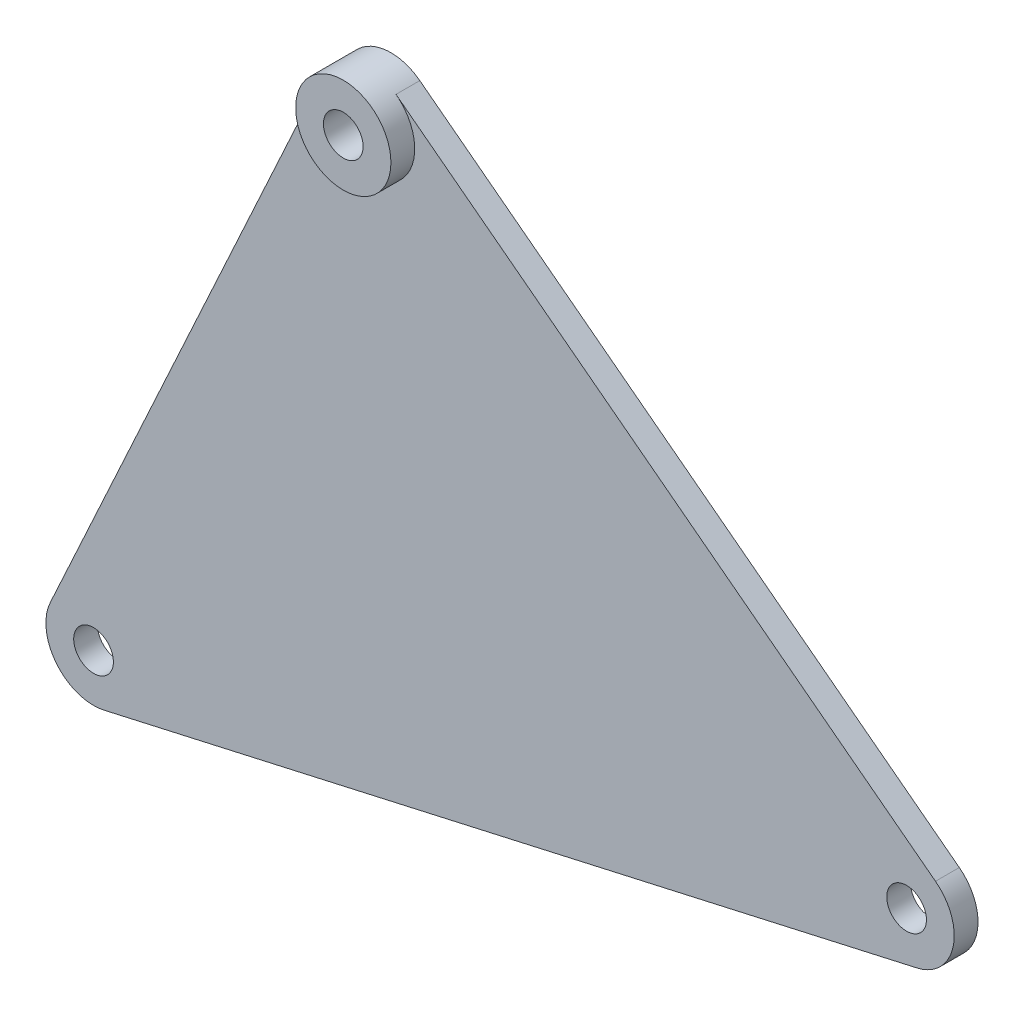
ISO-10303-21;
HEADER;
FILE_DESCRIPTION(('STEP AP214'),'2;1');
FILE_NAME('part.step','',(''),(''),'','','');
FILE_SCHEMA(('AUTOMOTIVE_DESIGN { 1 0 10303 214 1 1 1 1 }'));
ENDSEC;
DATA;
#1=APPLICATION_CONTEXT('core data for automotive mechanical design processes');
#2=APPLICATION_PROTOCOL_DEFINITION('international standard','automotive_design',2000,#1);
#3=PRODUCT_CONTEXT('',#1,'mechanical');
#4=PRODUCT('Part','Part','',(#3));
#5=PRODUCT_RELATED_PRODUCT_CATEGORY('part','',(#4));
#6=PRODUCT_DEFINITION_FORMATION('','',#4);
#7=PRODUCT_DEFINITION_CONTEXT('part definition',#1,'design');
#8=PRODUCT_DEFINITION('design','',#6,#7);
#9=PRODUCT_DEFINITION_SHAPE('','',#8);
#10=(LENGTH_UNIT() NAMED_UNIT(*) SI_UNIT(.MILLI.,.METRE.));
#11=(NAMED_UNIT(*) PLANE_ANGLE_UNIT() SI_UNIT($,.RADIAN.));
#12=(NAMED_UNIT(*) SI_UNIT($,.STERADIAN.) SOLID_ANGLE_UNIT());
#13=UNCERTAINTY_MEASURE_WITH_UNIT(LENGTH_MEASURE(1.E-05),#10,'distance_accuracy_value','');
#14=(GEOMETRIC_REPRESENTATION_CONTEXT(3) GLOBAL_UNCERTAINTY_ASSIGNED_CONTEXT((#13)) GLOBAL_UNIT_ASSIGNED_CONTEXT((#10,
#11,#12)) REPRESENTATION_CONTEXT('',''));
#15=CARTESIAN_POINT('',(0.,0.,0.));
#16=DIRECTION('',(0.,0.,1.));
#17=DIRECTION('',(1.,0.,0.));
#18=AXIS2_PLACEMENT_3D('',#15,#16,#17);
#19=CARTESIAN_POINT('',(1.31907722611703,-5.85320726367513,3.));
#20=DIRECTION('',(-0.219846204352838,0.975534543945856,0.));
#21=DIRECTION('',(-0.975534543945856,-0.219846204352838,0.));
#22=AXIS2_PLACEMENT_3D('',#19,#20,#21);
#23=PLANE('',#22);
#24=DIRECTION('',(0.975534543945857,0.219846204352838,0.));
#25=VECTOR('',#24,1.);
#26=CARTESIAN_POINT('',(1.31907722611703,-5.85320726367513,0.));
#27=LINE('',#26,#25);
#28=CARTESIAN_POINT('',(1.31907722611703,-5.85320726367514,0.));
#29=VERTEX_POINT('',#28);
#30=CARTESIAN_POINT('',(103.750204340432,17.2306441933729,0.));
#31=VERTEX_POINT('',#30);
#32=EDGE_CURVE('E134',#29,#31,#27,.T.);
#33=ORIENTED_EDGE('',*,*,#32,.T.);
#34=DIRECTION('',(0.,0.,-1.));
#35=VECTOR('',#34,1.);
#36=CARTESIAN_POINT('',(103.750204340432,17.2306441933729,3.));
#37=LINE('',#36,#35);
#38=CARTESIAN_POINT('',(103.750204340432,17.2306441933729,3.));
#39=VERTEX_POINT('',#38);
#40=EDGE_CURVE('E46',#39,#31,#37,.T.);
#41=ORIENTED_EDGE('',*,*,#40,.F.);
#42=DIRECTION('',(0.975534543945857,0.219846204352838,0.));
#43=VECTOR('',#42,1.);
#44=CARTESIAN_POINT('',(1.31907722611703,-5.85320726367513,3.));
#45=LINE('',#44,#43);
#46=CARTESIAN_POINT('',(1.31907722611703,-5.85320726367514,3.));
#47=VERTEX_POINT('',#46);
#48=EDGE_CURVE('E154',#47,#39,#45,.T.);
#49=ORIENTED_EDGE('',*,*,#48,.F.);
#50=DIRECTION('',(0.,0.,-1.));
#51=VECTOR('',#50,1.);
#52=CARTESIAN_POINT('',(1.31907722611703,-5.85320726367514,3.));
#53=LINE('',#52,#51);
#54=EDGE_CURVE('E133',#47,#29,#53,.T.);
#55=ORIENTED_EDGE('',*,*,#54,.T.);
#56=EDGE_LOOP('',(#33,#41,#49,#55));
#57=FACE_BOUND('',#56,.T.);
#58=ADVANCED_FACE('F43',(#57),#23,.F.);
#59=CARTESIAN_POINT('',(102.431127114315,23.083851457048,3.));
#60=DIRECTION('',(0.,0.,-1.));
#61=DIRECTION('',(-1.,0.,0.));
#62=AXIS2_PLACEMENT_3D('',#59,#60,#61);
#63=CYLINDRICAL_SURFACE('',#62,5.99999999999999);
#64=CARTESIAN_POINT('',(102.431127114315,23.083851457048,0.));
#65=DIRECTION('',(0.,0.,1.));
#66=DIRECTION('',(1.,0.,0.));
#67=AXIS2_PLACEMENT_3D('',#64,#65,#66);
#68=CIRCLE('',#67,5.99999999999999);
#69=CARTESIAN_POINT('',(106.071305847912,27.8534529904539,0.));
#70=VERTEX_POINT('',#69);
#71=EDGE_CURVE('E137',#31,#70,#68,.T.);
#72=ORIENTED_EDGE('',*,*,#71,.T.);
#73=DIRECTION('',(0.,0.,-1.));
#74=VECTOR('',#73,1.);
#75=CARTESIAN_POINT('',(106.071305847912,27.8534529904539,3.));
#76=LINE('',#75,#74);
#77=CARTESIAN_POINT('',(106.071305847912,27.8534529904539,3.));
#78=VERTEX_POINT('',#77);
#79=EDGE_CURVE('E157',#78,#70,#76,.T.);
#80=ORIENTED_EDGE('',*,*,#79,.F.);
#81=CARTESIAN_POINT('',(102.431127114315,23.083851457048,3.));
#82=DIRECTION('',(0.,0.,1.));
#83=DIRECTION('',(1.,0.,0.));
#84=AXIS2_PLACEMENT_3D('',#81,#82,#83);
#85=CIRCLE('',#84,5.99999999999999);
#86=EDGE_CURVE('E99',#39,#78,#85,.T.);
#87=ORIENTED_EDGE('',*,*,#86,.F.);
#88=ORIENTED_EDGE('',*,*,#40,.T.);
#89=EDGE_LOOP('',(#72,#80,#87,#88));
#90=FACE_BOUND('',#89,.T.);
#91=ADVANCED_FACE('F162',(#90),#63,.T.);
#92=CARTESIAN_POINT('',(52.4760465120087,68.7575666548204,3.));
#93=DIRECTION('',(-0.606696455599503,-0.794933588900985,0.));
#94=DIRECTION('',(0.794933588900985,-0.606696455599503,0.));
#95=AXIS2_PLACEMENT_3D('',#92,#93,#94);
#96=PLANE('',#95);
#97=DIRECTION('',(-0.794933588900985,0.606696455599503,0.));
#98=VECTOR('',#97,1.);
#99=CARTESIAN_POINT('',(52.4760465120087,68.7575666548204,0.));
#100=LINE('',#99,#98);
#101=CARTESIAN_POINT('',(38.1044839968777,79.7259999442114,0.));
#102=VERTEX_POINT('',#101);
#103=EDGE_CURVE('E140',#70,#102,#100,.T.);
#104=ORIENTED_EDGE('',*,*,#103,.T.);
#105=DIRECTION('',(0.,0.,-1.));
#106=VECTOR('',#105,1.);
#107=CARTESIAN_POINT('',(38.1044839968777,79.7259999442114,3.));
#108=LINE('',#107,#106);
#109=CARTESIAN_POINT('',(38.1044839968777,79.7259999442114,3.));
#110=VERTEX_POINT('',#109);
#111=EDGE_CURVE('E118',#110,#102,#108,.T.);
#112=ORIENTED_EDGE('',*,*,#111,.F.);
#113=DIRECTION('',(-0.794933588900985,0.606696455599503,0.));
#114=VECTOR('',#113,1.);
#115=CARTESIAN_POINT('',(52.4760465120087,68.7575666548204,3.));
#116=LINE('',#115,#114);
#117=EDGE_CURVE('E110',#78,#110,#116,.T.);
#118=ORIENTED_EDGE('',*,*,#117,.F.);
#119=ORIENTED_EDGE('',*,*,#79,.T.);
#120=EDGE_LOOP('',(#104,#112,#118,#119));
#121=FACE_BOUND('',#120,.T.);
#122=ADVANCED_FACE('F170',(#121),#96,.F.);
#123=CARTESIAN_POINT('',(34.4643052632807,74.9563984108055,3.));
#124=DIRECTION('',(0.,0.,-1.));
#125=DIRECTION('',(-1.,0.,0.));
#126=AXIS2_PLACEMENT_3D('',#123,#124,#125);
#127=CYLINDRICAL_SURFACE('',#126,6.);
#128=CARTESIAN_POINT('',(34.4643052632807,74.9563984108055,0.));
#129=DIRECTION('',(0.,0.,1.));
#130=DIRECTION('',(1.,0.,0.));
#131=AXIS2_PLACEMENT_3D('',#128,#129,#130);
#132=CIRCLE('',#131,6.);
#133=CARTESIAN_POINT('',(29.0129308334039,77.4628933390441,0.));
#134=VERTEX_POINT('',#133);
#135=EDGE_CURVE('E117',#102,#134,#132,.T.);
#136=ORIENTED_EDGE('',*,*,#135,.T.);
#137=DIRECTION('',(0.,0.,-1.));
#138=VECTOR('',#137,1.);
#139=CARTESIAN_POINT('',(29.0129308334039,77.4628933390441,3.));
#140=LINE('',#139,#138);
#141=CARTESIAN_POINT('',(29.0129308334039,77.4628933390441,3.));
#142=VERTEX_POINT('',#141);
#143=EDGE_CURVE('E113',#142,#134,#140,.T.);
#144=ORIENTED_EDGE('',*,*,#143,.F.);
#145=CARTESIAN_POINT('',(34.4643052632807,74.9563984108055,3.));
#146=DIRECTION('',(0.,0.,1.));
#147=DIRECTION('',(1.,0.,0.));
#148=AXIS2_PLACEMENT_3D('',#145,#146,#147);
#149=CIRCLE('',#148,6.);
#150=EDGE_CURVE('E12',#142,#110,#149,.T.);
#151=ORIENTED_EDGE('',*,*,#150,.T.);
#152=ORIENTED_EDGE('',*,*,#111,.T.);
#153=EDGE_LOOP('',(#136,#144,#151,#152));
#154=FACE_BOUND('',#153,.T.);
#155=CARTESIAN_POINT('',(34.4643052632807,74.9563984108055,6.));
#156=DIRECTION('',(0.,0.,1.));
#157=DIRECTION('',(1.,0.,0.));
#158=AXIS2_PLACEMENT_3D('',#155,#156,#157);
#159=CIRCLE('',#158,6.);
#160=CARTESIAN_POINT('',(40.4643052632807,74.9563984108055,6.));
#161=VERTEX_POINT('',#160);
#162=EDGE_CURVE('E138',#161,#161,#159,.T.);
#163=ORIENTED_EDGE('',*,*,#162,.F.);
#164=EDGE_LOOP('',(#163));
#165=FACE_BOUND('',#164,.T.);
#166=ADVANCED_FACE('F114',(#154,#165),#127,.T.);
#167=CARTESIAN_POINT('',(-5.45137442987676,2.5064949282386,3.));
#168=DIRECTION('',(0.90856240497946,-0.417749154706432,0.));
#169=DIRECTION('',(0.417749154706433,0.908562404979461,0.));
#170=AXIS2_PLACEMENT_3D('',#167,#168,#169);
#171=PLANE('',#170);
#172=DIRECTION('',(-0.417749154706433,-0.908562404979461,0.));
#173=VECTOR('',#172,1.);
#174=CARTESIAN_POINT('',(-5.45137442987676,2.5064949282386,0.));
#175=LINE('',#174,#173);
#176=CARTESIAN_POINT('',(-5.45137442987677,2.50649492823859,0.));
#177=VERTEX_POINT('',#176);
#178=EDGE_CURVE('E84',#134,#177,#175,.T.);
#179=ORIENTED_EDGE('',*,*,#178,.T.);
#180=DIRECTION('',(0.,0.,-1.));
#181=VECTOR('',#180,1.);
#182=CARTESIAN_POINT('',(-5.45137442987677,2.50649492823859,3.));
#183=LINE('',#182,#181);
#184=CARTESIAN_POINT('',(-5.45137442987677,2.50649492823859,3.));
#185=VERTEX_POINT('',#184);
#186=EDGE_CURVE('E119',#185,#177,#183,.T.);
#187=ORIENTED_EDGE('',*,*,#186,.F.);
#188=DIRECTION('',(-0.417749154706433,-0.908562404979461,0.));
#189=VECTOR('',#188,1.);
#190=CARTESIAN_POINT('',(-5.45137442987676,2.5064949282386,3.));
#191=LINE('',#190,#189);
#192=EDGE_CURVE('E108',#142,#185,#191,.T.);
#193=ORIENTED_EDGE('',*,*,#192,.F.);
#194=ORIENTED_EDGE('',*,*,#143,.T.);
#195=EDGE_LOOP('',(#179,#187,#193,#194));
#196=FACE_BOUND('',#195,.T.);
#197=ADVANCED_FACE('F121',(#196),#171,.F.);
#198=CARTESIAN_POINT('',(34.4643052632807,74.9563984108055,3.));
#199=DIRECTION('',(0.,0.,-1.));
#200=DIRECTION('',(-1.,0.,0.));
#201=AXIS2_PLACEMENT_3D('',#198,#199,#200);
#202=CYLINDRICAL_SURFACE('',#201,2.5);
#203=CARTESIAN_POINT('',(34.4643052632807,74.9563984108055,0.));
#204=DIRECTION('',(0.,0.,1.));
#205=DIRECTION('',(1.,0.,0.));
#206=AXIS2_PLACEMENT_3D('',#203,#204,#205);
#207=CIRCLE('',#206,2.5);
#208=CARTESIAN_POINT('',(36.9643052632807,74.9563984108055,0.));
#209=VERTEX_POINT('',#208);
#210=EDGE_CURVE('E148',#209,#209,#207,.T.);
#211=ORIENTED_EDGE('',*,*,#210,.F.);
#212=EDGE_LOOP('',(#211));
#213=FACE_BOUND('',#212,.T.);
#214=CARTESIAN_POINT('',(34.4643052632807,74.9563984108055,6.));
#215=DIRECTION('',(0.,0.,1.));
#216=DIRECTION('',(1.,0.,0.));
#217=AXIS2_PLACEMENT_3D('',#214,#215,#216);
#218=CIRCLE('',#217,2.5);
#219=CARTESIAN_POINT('',(36.9643052632807,74.9563984108055,6.));
#220=VERTEX_POINT('',#219);
#221=EDGE_CURVE('E283',#220,#220,#218,.T.);
#222=ORIENTED_EDGE('',*,*,#221,.T.);
#223=EDGE_LOOP('',(#222));
#224=FACE_BOUND('',#223,.T.);
#225=ADVANCED_FACE('F201',(#213,#224),#202,.F.);
#226=CARTESIAN_POINT('',(0.,0.,3.));
#227=DIRECTION('',(0.,0.,-1.));
#228=DIRECTION('',(-1.,0.,0.));
#229=AXIS2_PLACEMENT_3D('',#226,#227,#228);
#230=CYLINDRICAL_SURFACE('',#229,2.5);
#231=CARTESIAN_POINT('',(0.,0.,3.));
#232=DIRECTION('',(0.,0.,1.));
#233=DIRECTION('',(1.,0.,0.));
#234=AXIS2_PLACEMENT_3D('',#231,#232,#233);
#235=CIRCLE('',#234,2.5);
#236=CARTESIAN_POINT('',(2.5,0.,3.));
#237=VERTEX_POINT('',#236);
#238=EDGE_CURVE('E123',#237,#237,#235,.T.);
#239=ORIENTED_EDGE('',*,*,#238,.T.);
#240=EDGE_LOOP('',(#239));
#241=FACE_BOUND('',#240,.T.);
#242=CARTESIAN_POINT('',(0.,0.,0.));
#243=DIRECTION('',(0.,0.,1.));
#244=DIRECTION('',(1.,0.,0.));
#245=AXIS2_PLACEMENT_3D('',#242,#243,#244);
#246=CIRCLE('',#245,2.5);
#247=CARTESIAN_POINT('',(2.5,0.,0.));
#248=VERTEX_POINT('',#247);
#249=EDGE_CURVE('E145',#248,#248,#246,.T.);
#250=ORIENTED_EDGE('',*,*,#249,.F.);
#251=EDGE_LOOP('',(#250));
#252=FACE_BOUND('',#251,.T.);
#253=ADVANCED_FACE('F195',(#241,#252),#230,.F.);
#254=CARTESIAN_POINT('',(0.,0.,3.));
#255=DIRECTION('',(0.,0.,-1.));
#256=DIRECTION('',(-1.,0.,0.));
#257=AXIS2_PLACEMENT_3D('',#254,#255,#256);
#258=CYLINDRICAL_SURFACE('',#257,6.);
#259=CARTESIAN_POINT('',(0.,0.,0.));
#260=DIRECTION('',(0.,0.,1.));
#261=DIRECTION('',(1.,0.,0.));
#262=AXIS2_PLACEMENT_3D('',#259,#260,#261);
#263=CIRCLE('',#262,6.);
#264=EDGE_CURVE('E90',#177,#29,#263,.T.);
#265=ORIENTED_EDGE('',*,*,#264,.T.);
#266=ORIENTED_EDGE('',*,*,#54,.F.);
#267=CARTESIAN_POINT('',(0.,0.,3.));
#268=DIRECTION('',(0.,0.,1.));
#269=DIRECTION('',(1.,0.,0.));
#270=AXIS2_PLACEMENT_3D('',#267,#268,#269);
#271=CIRCLE('',#270,6.);
#272=EDGE_CURVE('E60',#185,#47,#271,.T.);
#273=ORIENTED_EDGE('',*,*,#272,.F.);
#274=ORIENTED_EDGE('',*,*,#186,.T.);
#275=EDGE_LOOP('',(#265,#266,#273,#274));
#276=FACE_BOUND('',#275,.T.);
#277=ADVANCED_FACE('F200',(#276),#258,.T.);
#278=CARTESIAN_POINT('',(102.431127114315,23.083851457048,3.));
#279=DIRECTION('',(0.,0.,-1.));
#280=DIRECTION('',(-1.,0.,0.));
#281=AXIS2_PLACEMENT_3D('',#278,#279,#280);
#282=CYLINDRICAL_SURFACE('',#281,2.49999999999999);
#283=CARTESIAN_POINT('',(102.431127114315,23.083851457048,3.));
#284=DIRECTION('',(0.,0.,1.));
#285=DIRECTION('',(1.,0.,0.));
#286=AXIS2_PLACEMENT_3D('',#283,#284,#285);
#287=CIRCLE('',#286,2.49999999999999);
#288=CARTESIAN_POINT('',(104.931127114315,23.083851457048,3.));
#289=VERTEX_POINT('',#288);
#290=EDGE_CURVE('E130',#289,#289,#287,.T.);
#291=ORIENTED_EDGE('',*,*,#290,.T.);
#292=EDGE_LOOP('',(#291));
#293=FACE_BOUND('',#292,.T.);
#294=CARTESIAN_POINT('',(102.431127114315,23.083851457048,0.));
#295=DIRECTION('',(0.,0.,1.));
#296=DIRECTION('',(1.,0.,0.));
#297=AXIS2_PLACEMENT_3D('',#294,#295,#296);
#298=CIRCLE('',#297,2.49999999999999);
#299=CARTESIAN_POINT('',(104.931127114315,23.083851457048,0.));
#300=VERTEX_POINT('',#299);
#301=EDGE_CURVE('E151',#300,#300,#298,.T.);
#302=ORIENTED_EDGE('',*,*,#301,.F.);
#303=EDGE_LOOP('',(#302));
#304=FACE_BOUND('',#303,.T.);
#305=ADVANCED_FACE('F213',(#293,#304),#282,.F.);
#306=CARTESIAN_POINT('',(0.,0.,3.));
#307=DIRECTION('',(0.,0.,1.));
#308=DIRECTION('',(1.,0.,0.));
#309=AXIS2_PLACEMENT_3D('',#306,#307,#308);
#310=PLANE('',#309);
#311=ORIENTED_EDGE('',*,*,#150,.F.);
#312=ORIENTED_EDGE('',*,*,#192,.T.);
#313=ORIENTED_EDGE('',*,*,#272,.T.);
#314=ORIENTED_EDGE('',*,*,#48,.T.);
#315=ORIENTED_EDGE('',*,*,#86,.T.);
#316=ORIENTED_EDGE('',*,*,#117,.T.);
#317=EDGE_LOOP('',(#311,#312,#313,#314,#315,#316));
#318=FACE_BOUND('',#317,.T.);
#319=ORIENTED_EDGE('',*,*,#238,.F.);
#320=EDGE_LOOP('',(#319));
#321=FACE_BOUND('',#320,.T.);
#322=ORIENTED_EDGE('',*,*,#290,.F.);
#323=EDGE_LOOP('',(#322));
#324=FACE_BOUND('',#323,.T.);
#325=ADVANCED_FACE('F105',(#318,#321,#324),#310,.T.);
#326=CARTESIAN_POINT('',(0.,0.,0.));
#327=DIRECTION('',(0.,0.,1.));
#328=DIRECTION('',(1.,0.,0.));
#329=AXIS2_PLACEMENT_3D('',#326,#327,#328);
#330=PLANE('',#329);
#331=ORIENTED_EDGE('',*,*,#32,.F.);
#332=ORIENTED_EDGE('',*,*,#264,.F.);
#333=ORIENTED_EDGE('',*,*,#178,.F.);
#334=ORIENTED_EDGE('',*,*,#135,.F.);
#335=ORIENTED_EDGE('',*,*,#103,.F.);
#336=ORIENTED_EDGE('',*,*,#71,.F.);
#337=EDGE_LOOP('',(#331,#332,#333,#334,#335,#336));
#338=FACE_BOUND('',#337,.T.);
#339=ORIENTED_EDGE('',*,*,#249,.T.);
#340=EDGE_LOOP('',(#339));
#341=FACE_BOUND('',#340,.T.);
#342=ORIENTED_EDGE('',*,*,#210,.T.);
#343=EDGE_LOOP('',(#342));
#344=FACE_BOUND('',#343,.T.);
#345=ORIENTED_EDGE('',*,*,#301,.T.);
#346=EDGE_LOOP('',(#345));
#347=FACE_BOUND('',#346,.T.);
#348=ADVANCED_FACE('F167',(#338,#341,#344,#347),#330,.F.);
#349=CARTESIAN_POINT('',(34.4643052632807,74.9563984108055,6.));
#350=DIRECTION('',(0.,0.,1.));
#351=DIRECTION('',(1.,0.,0.));
#352=AXIS2_PLACEMENT_3D('',#349,#350,#351);
#353=PLANE('',#352);
#354=ORIENTED_EDGE('',*,*,#162,.T.);
#355=EDGE_LOOP('',(#354));
#356=FACE_BOUND('',#355,.T.);
#357=ORIENTED_EDGE('',*,*,#221,.F.);
#358=EDGE_LOOP('',(#357));
#359=FACE_BOUND('',#358,.T.);
#360=ADVANCED_FACE('F233',(#356,#359),#353,.T.);
#361=CLOSED_SHELL('',(#58,#91,#122,#166,#197,#225,#253,#277,#305,#325,#348,#360));
#362=MANIFOLD_SOLID_BREP('B2',#361);
#363=ADVANCED_BREP_SHAPE_REPRESENTATION('',(#18,#362),#14);
#364=SHAPE_DEFINITION_REPRESENTATION(#9,#363);
ENDSEC;
END-ISO-10303-21;
